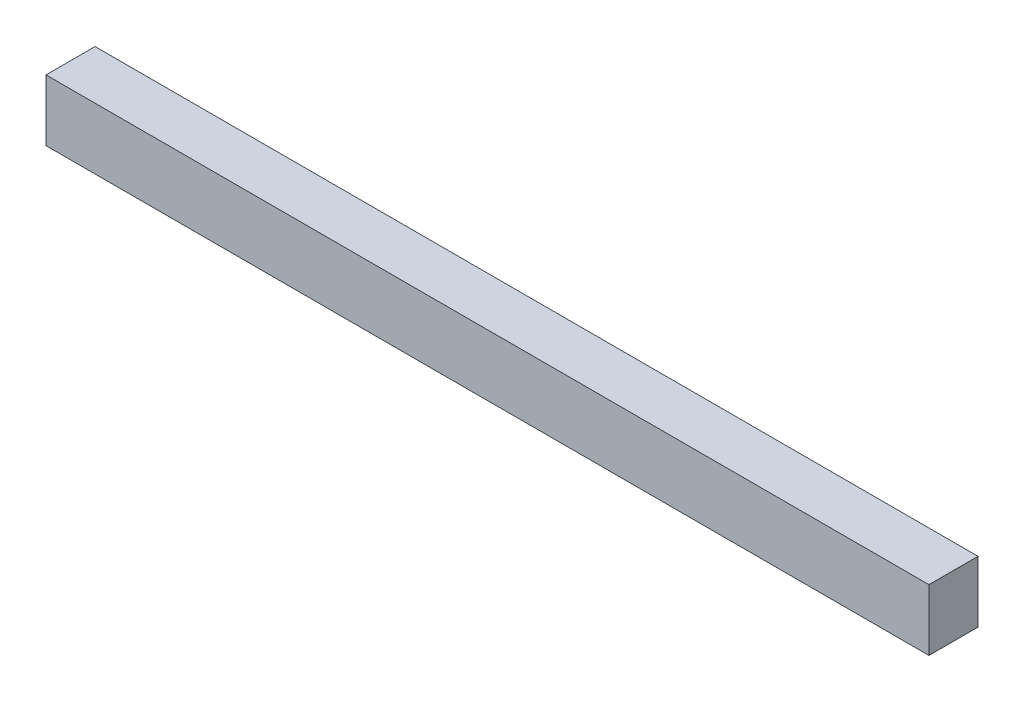
ISO-10303-21;
HEADER;
FILE_DESCRIPTION(('STEP AP214'),'2;1');
FILE_NAME('part.step','',(''),(''),'','','');
FILE_SCHEMA(('AUTOMOTIVE_DESIGN { 1 0 10303 214 1 1 1 1 }'));
ENDSEC;
DATA;
#1=APPLICATION_CONTEXT('core data for automotive mechanical design processes');
#2=APPLICATION_PROTOCOL_DEFINITION('international standard','automotive_design',2000,#1);
#3=PRODUCT_CONTEXT('',#1,'mechanical');
#4=PRODUCT('Part','Part','',(#3));
#5=PRODUCT_RELATED_PRODUCT_CATEGORY('part','',(#4));
#6=PRODUCT_DEFINITION_FORMATION('','',#4);
#7=PRODUCT_DEFINITION_CONTEXT('part definition',#1,'design');
#8=PRODUCT_DEFINITION('design','',#6,#7);
#9=PRODUCT_DEFINITION_SHAPE('','',#8);
#10=(LENGTH_UNIT() NAMED_UNIT(*) SI_UNIT(.MILLI.,.METRE.));
#11=(NAMED_UNIT(*) PLANE_ANGLE_UNIT() SI_UNIT($,.RADIAN.));
#12=(NAMED_UNIT(*) SI_UNIT($,.STERADIAN.) SOLID_ANGLE_UNIT());
#13=UNCERTAINTY_MEASURE_WITH_UNIT(LENGTH_MEASURE(1.E-05),#10,'distance_accuracy_value','');
#14=(GEOMETRIC_REPRESENTATION_CONTEXT(3) GLOBAL_UNCERTAINTY_ASSIGNED_CONTEXT((#13)) GLOBAL_UNIT_ASSIGNED_CONTEXT((#10,
#11,#12)) REPRESENTATION_CONTEXT('',''));
#15=CARTESIAN_POINT('',(0.,0.,0.));
#16=DIRECTION('',(0.,0.,1.));
#17=DIRECTION('',(1.,0.,0.));
#18=AXIS2_PLACEMENT_3D('',#15,#16,#17);
#19=CARTESIAN_POINT('',(360.,12.5,10.));
#20=DIRECTION('',(0.,0.,-1.));
#21=DIRECTION('',(0.,1.,0.));
#22=AXIS2_PLACEMENT_3D('',#19,#20,#21);
#23=PLANE('',#22);
#24=DIRECTION('',(0.,-1.,0.));
#25=VECTOR('',#24,1.);
#26=CARTESIAN_POINT('',(0.,12.5,10.));
#27=LINE('',#26,#25);
#28=CARTESIAN_POINT('',(0.,12.5,10.));
#29=VERTEX_POINT('',#28);
#30=CARTESIAN_POINT('',(0.,-12.5,10.));
#31=VERTEX_POINT('',#30);
#32=EDGE_CURVE('E96',#29,#31,#27,.T.);
#33=ORIENTED_EDGE('',*,*,#32,.T.);
#34=DIRECTION('',(-1.,0.,0.));
#35=VECTOR('',#34,1.);
#36=CARTESIAN_POINT('',(360.,-12.5,10.));
#37=LINE('',#36,#35);
#38=CARTESIAN_POINT('',(360.,-12.5,10.));
#39=VERTEX_POINT('',#38);
#40=EDGE_CURVE('E11',#39,#31,#37,.T.);
#41=ORIENTED_EDGE('',*,*,#40,.F.);
#42=DIRECTION('',(0.,-1.,0.));
#43=VECTOR('',#42,1.);
#44=CARTESIAN_POINT('',(360.,12.5,10.));
#45=LINE('',#44,#43);
#46=CARTESIAN_POINT('',(360.,12.5,10.));
#47=VERTEX_POINT('',#46);
#48=EDGE_CURVE('E84',#47,#39,#45,.T.);
#49=ORIENTED_EDGE('',*,*,#48,.F.);
#50=DIRECTION('',(-1.,0.,0.));
#51=VECTOR('',#50,1.);
#52=CARTESIAN_POINT('',(360.,12.5,10.));
#53=LINE('',#52,#51);
#54=EDGE_CURVE('E92',#47,#29,#53,.T.);
#55=ORIENTED_EDGE('',*,*,#54,.T.);
#56=EDGE_LOOP('',(#33,#41,#49,#55));
#57=FACE_BOUND('',#56,.T.);
#58=ADVANCED_FACE('F33',(#57),#23,.F.);
#59=CARTESIAN_POINT('',(360.,-12.5,-10.));
#60=DIRECTION('',(0.,1.,0.));
#61=DIRECTION('',(0.,0.,1.));
#62=AXIS2_PLACEMENT_3D('',#59,#60,#61);
#63=PLANE('',#62);
#64=DIRECTION('',(0.,0.,-1.));
#65=VECTOR('',#64,1.);
#66=CARTESIAN_POINT('',(0.,-12.5,-10.));
#67=LINE('',#66,#65);
#68=CARTESIAN_POINT('',(0.,-12.5,-10.));
#69=VERTEX_POINT('',#68);
#70=EDGE_CURVE('E88',#31,#69,#67,.T.);
#71=ORIENTED_EDGE('',*,*,#70,.T.);
#72=DIRECTION('',(-1.,0.,0.));
#73=VECTOR('',#72,1.);
#74=CARTESIAN_POINT('',(360.,-12.5,-10.));
#75=LINE('',#74,#73);
#76=CARTESIAN_POINT('',(360.,-12.5,-10.));
#77=VERTEX_POINT('',#76);
#78=EDGE_CURVE('E41',#77,#69,#75,.T.);
#79=ORIENTED_EDGE('',*,*,#78,.F.);
#80=DIRECTION('',(0.,0.,-1.));
#81=VECTOR('',#80,1.);
#82=CARTESIAN_POINT('',(360.,-12.5,-10.));
#83=LINE('',#82,#81);
#84=EDGE_CURVE('E79',#39,#77,#83,.T.);
#85=ORIENTED_EDGE('',*,*,#84,.F.);
#86=ORIENTED_EDGE('',*,*,#40,.T.);
#87=EDGE_LOOP('',(#71,#79,#85,#86));
#88=FACE_BOUND('',#87,.T.);
#89=ADVANCED_FACE('F87',(#88),#63,.F.);
#90=CARTESIAN_POINT('',(360.,12.5,-10.));
#91=DIRECTION('',(0.,0.,1.));
#92=DIRECTION('',(0.,-1.,0.));
#93=AXIS2_PLACEMENT_3D('',#90,#91,#92);
#94=PLANE('',#93);
#95=DIRECTION('',(0.,1.,0.));
#96=VECTOR('',#95,1.);
#97=CARTESIAN_POINT('',(0.,12.5,-10.));
#98=LINE('',#97,#96);
#99=CARTESIAN_POINT('',(0.,12.5,-10.));
#100=VERTEX_POINT('',#99);
#101=EDGE_CURVE('E66',#69,#100,#98,.T.);
#102=ORIENTED_EDGE('',*,*,#101,.T.);
#103=DIRECTION('',(-1.,0.,0.));
#104=VECTOR('',#103,1.);
#105=CARTESIAN_POINT('',(360.,12.5,-10.));
#106=LINE('',#105,#104);
#107=CARTESIAN_POINT('',(360.,12.5,-10.));
#108=VERTEX_POINT('',#107);
#109=EDGE_CURVE('E89',#108,#100,#106,.T.);
#110=ORIENTED_EDGE('',*,*,#109,.F.);
#111=DIRECTION('',(0.,1.,0.));
#112=VECTOR('',#111,1.);
#113=CARTESIAN_POINT('',(360.,12.5,-10.));
#114=LINE('',#113,#112);
#115=EDGE_CURVE('E82',#77,#108,#114,.T.);
#116=ORIENTED_EDGE('',*,*,#115,.F.);
#117=ORIENTED_EDGE('',*,*,#78,.T.);
#118=EDGE_LOOP('',(#102,#110,#116,#117));
#119=FACE_BOUND('',#118,.T.);
#120=ADVANCED_FACE('F90',(#119),#94,.F.);
#121=CARTESIAN_POINT('',(360.,12.5,-10.));
#122=DIRECTION('',(0.,-1.,0.));
#123=DIRECTION('',(0.,0.,-1.));
#124=AXIS2_PLACEMENT_3D('',#121,#122,#123);
#125=PLANE('',#124);
#126=DIRECTION('',(0.,0.,1.));
#127=VECTOR('',#126,1.);
#128=CARTESIAN_POINT('',(0.,12.5,-10.));
#129=LINE('',#128,#127);
#130=EDGE_CURVE('E72',#100,#29,#129,.T.);
#131=ORIENTED_EDGE('',*,*,#130,.T.);
#132=ORIENTED_EDGE('',*,*,#54,.F.);
#133=DIRECTION('',(0.,0.,1.));
#134=VECTOR('',#133,1.);
#135=CARTESIAN_POINT('',(360.,12.5,-10.));
#136=LINE('',#135,#134);
#137=EDGE_CURVE('E49',#108,#47,#136,.T.);
#138=ORIENTED_EDGE('',*,*,#137,.F.);
#139=ORIENTED_EDGE('',*,*,#109,.T.);
#140=EDGE_LOOP('',(#131,#132,#138,#139));
#141=FACE_BOUND('',#140,.T.);
#142=ADVANCED_FACE('F103',(#141),#125,.F.);
#143=CARTESIAN_POINT('',(360.,0.,0.));
#144=DIRECTION('',(-1.,0.,0.));
#145=DIRECTION('',(0.,0.,1.));
#146=AXIS2_PLACEMENT_3D('',#143,#144,#145);
#147=PLANE('',#146);
#148=ORIENTED_EDGE('',*,*,#48,.T.);
#149=ORIENTED_EDGE('',*,*,#84,.T.);
#150=ORIENTED_EDGE('',*,*,#115,.T.);
#151=ORIENTED_EDGE('',*,*,#137,.T.);
#152=EDGE_LOOP('',(#148,#149,#150,#151));
#153=FACE_BOUND('',#152,.T.);
#154=ADVANCED_FACE('F80',(#153),#147,.F.);
#155=CARTESIAN_POINT('',(0.,0.,0.));
#156=DIRECTION('',(-1.,0.,0.));
#157=DIRECTION('',(0.,0.,1.));
#158=AXIS2_PLACEMENT_3D('',#155,#156,#157);
#159=PLANE('',#158);
#160=ORIENTED_EDGE('',*,*,#32,.F.);
#161=ORIENTED_EDGE('',*,*,#130,.F.);
#162=ORIENTED_EDGE('',*,*,#101,.F.);
#163=ORIENTED_EDGE('',*,*,#70,.F.);
#164=EDGE_LOOP('',(#160,#161,#162,#163));
#165=FACE_BOUND('',#164,.T.);
#166=ADVANCED_FACE('F106',(#165),#159,.T.);
#167=CLOSED_SHELL('',(#58,#89,#120,#142,#154,#166));
#168=MANIFOLD_SOLID_BREP('B2',#167);
#169=ADVANCED_BREP_SHAPE_REPRESENTATION('',(#18,#168),#14);
#170=SHAPE_DEFINITION_REPRESENTATION(#9,#169);
ENDSEC;
END-ISO-10303-21;
